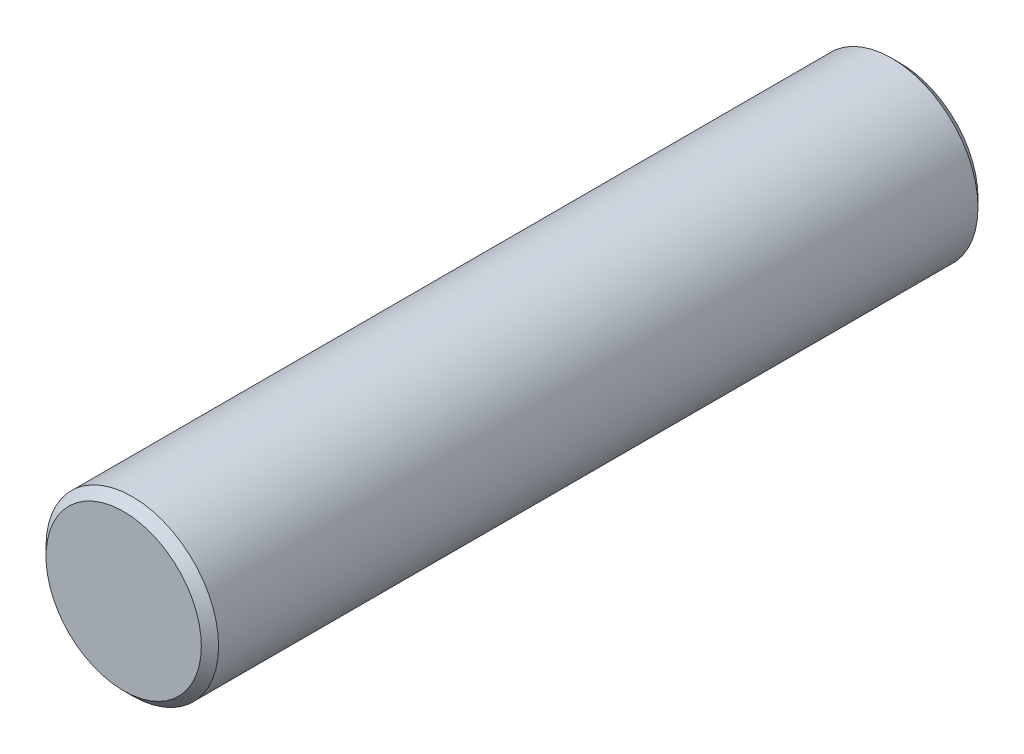
ISO-10303-21;
HEADER;
FILE_DESCRIPTION(('STEP AP214'),'2;1');
FILE_NAME('part.step','',(''),(''),'','','');
FILE_SCHEMA(('AUTOMOTIVE_DESIGN { 1 0 10303 214 1 1 1 1 }'));
ENDSEC;
DATA;
#1=APPLICATION_CONTEXT('core data for automotive mechanical design processes');
#2=APPLICATION_PROTOCOL_DEFINITION('international standard','automotive_design',2000,#1);
#3=PRODUCT_CONTEXT('',#1,'mechanical');
#4=PRODUCT('Part','Part','',(#3));
#5=PRODUCT_RELATED_PRODUCT_CATEGORY('part','',(#4));
#6=PRODUCT_DEFINITION_FORMATION('','',#4);
#7=PRODUCT_DEFINITION_CONTEXT('part definition',#1,'design');
#8=PRODUCT_DEFINITION('design','',#6,#7);
#9=PRODUCT_DEFINITION_SHAPE('','',#8);
#10=(LENGTH_UNIT() NAMED_UNIT(*) SI_UNIT(.MILLI.,.METRE.));
#11=(NAMED_UNIT(*) PLANE_ANGLE_UNIT() SI_UNIT($,.RADIAN.));
#12=(NAMED_UNIT(*) SI_UNIT($,.STERADIAN.) SOLID_ANGLE_UNIT());
#13=UNCERTAINTY_MEASURE_WITH_UNIT(LENGTH_MEASURE(1.E-05),#10,'distance_accuracy_value','');
#14=(GEOMETRIC_REPRESENTATION_CONTEXT(3) GLOBAL_UNCERTAINTY_ASSIGNED_CONTEXT((#13)) GLOBAL_UNIT_ASSIGNED_CONTEXT((#10,
#11,#12)) REPRESENTATION_CONTEXT('',''));
#15=CARTESIAN_POINT('',(0.,0.,0.));
#16=DIRECTION('',(0.,0.,1.));
#17=DIRECTION('',(1.,0.,0.));
#18=AXIS2_PLACEMENT_3D('',#15,#16,#17);
#19=CARTESIAN_POINT('',(0.,0.,9.));
#20=DIRECTION('',(0.,0.,-1.));
#21=DIRECTION('',(-1.,0.,0.));
#22=AXIS2_PLACEMENT_3D('',#19,#20,#21);
#23=CYLINDRICAL_SURFACE('',#22,2.);
#24=CARTESIAN_POINT('',(0.,0.,-8.8));
#25=DIRECTION('',(0.,0.,1.));
#26=DIRECTION('',(1.,0.,0.));
#27=AXIS2_PLACEMENT_3D('',#24,#25,#26);
#28=CIRCLE('',#27,2.);
#29=CARTESIAN_POINT('',(2.,0.,-8.8));
#30=VERTEX_POINT('',#29);
#31=EDGE_CURVE('E56',#30,#30,#28,.T.);
#32=ORIENTED_EDGE('',*,*,#31,.T.);
#33=EDGE_LOOP('',(#32));
#34=FACE_BOUND('',#33,.T.);
#35=CARTESIAN_POINT('',(0.,0.,8.8));
#36=DIRECTION('',(0.,0.,1.));
#37=DIRECTION('',(1.,0.,0.));
#38=AXIS2_PLACEMENT_3D('',#35,#36,#37);
#39=CIRCLE('',#38,2.);
#40=CARTESIAN_POINT('',(2.,0.,8.8));
#41=VERTEX_POINT('',#40);
#42=EDGE_CURVE('E61',#41,#41,#39,.F.);
#43=ORIENTED_EDGE('',*,*,#42,.T.);
#44=EDGE_LOOP('',(#43));
#45=FACE_BOUND('',#44,.T.);
#46=ADVANCED_FACE('F44',(#34,#45),#23,.T.);
#47=CARTESIAN_POINT('',(0.,0.,9.));
#48=DIRECTION('',(0.,0.,1.));
#49=DIRECTION('',(1.,0.,0.));
#50=AXIS2_PLACEMENT_3D('',#47,#48,#49);
#51=PLANE('',#50);
#52=CARTESIAN_POINT('',(0.,0.,9.));
#53=DIRECTION('',(0.,0.,1.));
#54=DIRECTION('',(1.,0.,0.));
#55=AXIS2_PLACEMENT_3D('',#52,#53,#54);
#56=CIRCLE('',#55,1.8);
#57=CARTESIAN_POINT('',(1.8,0.,9.));
#58=VERTEX_POINT('',#57);
#59=EDGE_CURVE('E10',#58,#58,#56,.T.);
#60=ORIENTED_EDGE('',*,*,#59,.T.);
#61=EDGE_LOOP('',(#60));
#62=FACE_BOUND('',#61,.T.);
#63=ADVANCED_FACE('F82',(#62),#51,.T.);
#64=CARTESIAN_POINT('',(0.,0.,-9.));
#65=DIRECTION('',(0.,0.,1.));
#66=DIRECTION('',(1.,0.,0.));
#67=AXIS2_PLACEMENT_3D('',#64,#65,#66);
#68=PLANE('',#67);
#69=CARTESIAN_POINT('',(0.,0.,-9.));
#70=DIRECTION('',(0.,0.,1.));
#71=DIRECTION('',(1.,0.,0.));
#72=AXIS2_PLACEMENT_3D('',#69,#70,#71);
#73=CIRCLE('',#72,1.8);
#74=CARTESIAN_POINT('',(1.8,0.,-9.));
#75=VERTEX_POINT('',#74);
#76=EDGE_CURVE('E53',#75,#75,#73,.F.);
#77=ORIENTED_EDGE('',*,*,#76,.T.);
#78=EDGE_LOOP('',(#77));
#79=FACE_BOUND('',#78,.T.);
#80=ADVANCED_FACE('F79',(#79),#68,.F.);
#81=CARTESIAN_POINT('',(0.,0.,-8.8));
#82=DIRECTION('',(0.,0.,1.));
#83=DIRECTION('',(1.,0.,0.));
#84=AXIS2_PLACEMENT_3D('',#81,#82,#83);
#85=CONICAL_SURFACE('',#84,2.,0.785398163397448);
#86=ORIENTED_EDGE('',*,*,#76,.F.);
#87=EDGE_LOOP('',(#86));
#88=FACE_BOUND('',#87,.T.);
#89=ORIENTED_EDGE('',*,*,#31,.F.);
#90=EDGE_LOOP('',(#89));
#91=FACE_BOUND('',#90,.T.);
#92=ADVANCED_FACE('F74',(#88,#91),#85,.T.);
#93=CARTESIAN_POINT('',(0.,0.,9.));
#94=DIRECTION('',(0.,0.,-1.));
#95=DIRECTION('',(-1.,0.,0.));
#96=AXIS2_PLACEMENT_3D('',#93,#94,#95);
#97=CONICAL_SURFACE('',#96,1.8,0.785398163397448);
#98=ORIENTED_EDGE('',*,*,#42,.F.);
#99=EDGE_LOOP('',(#98));
#100=FACE_BOUND('',#99,.T.);
#101=ORIENTED_EDGE('',*,*,#59,.F.);
#102=EDGE_LOOP('',(#101));
#103=FACE_BOUND('',#102,.T.);
#104=ADVANCED_FACE('F48',(#100,#103),#97,.T.);
#105=CLOSED_SHELL('',(#46,#63,#80,#92,#104));
#106=MANIFOLD_SOLID_BREP('B2',#105);
#107=ADVANCED_BREP_SHAPE_REPRESENTATION('',(#18,#106),#14);
#108=SHAPE_DEFINITION_REPRESENTATION(#9,#107);
ENDSEC;
END-ISO-10303-21;
